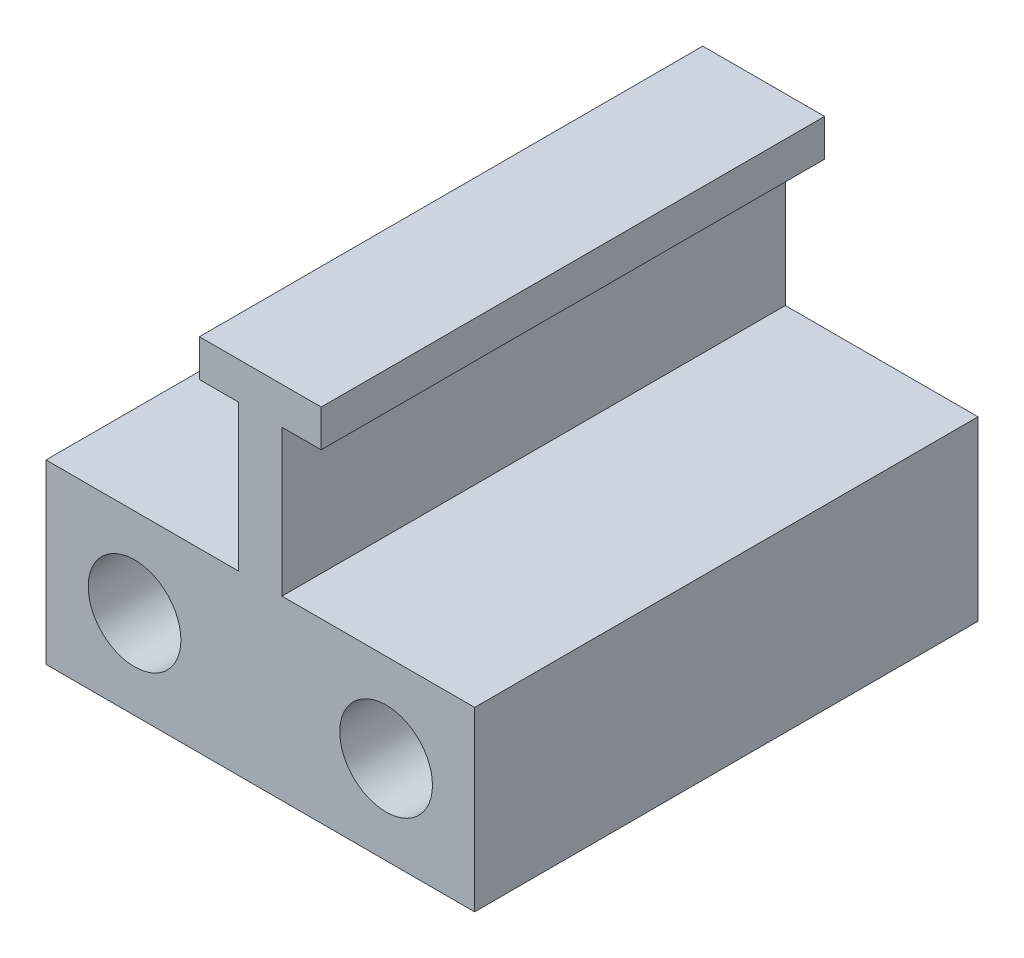
ISO-10303-21;
HEADER;
FILE_DESCRIPTION(('STEP AP214'),'2;1');
FILE_NAME('part.step','',(''),(''),'','','');
FILE_SCHEMA(('AUTOMOTIVE_DESIGN { 1 0 10303 214 1 1 1 1 }'));
ENDSEC;
DATA;
#1=APPLICATION_CONTEXT('core data for automotive mechanical design processes');
#2=APPLICATION_PROTOCOL_DEFINITION('international standard','automotive_design',2000,#1);
#3=PRODUCT_CONTEXT('',#1,'mechanical');
#4=PRODUCT('Part','Part','',(#3));
#5=PRODUCT_RELATED_PRODUCT_CATEGORY('part','',(#4));
#6=PRODUCT_DEFINITION_FORMATION('','',#4);
#7=PRODUCT_DEFINITION_CONTEXT('part definition',#1,'design');
#8=PRODUCT_DEFINITION('design','',#6,#7);
#9=PRODUCT_DEFINITION_SHAPE('','',#8);
#10=(LENGTH_UNIT() NAMED_UNIT(*) SI_UNIT(.MILLI.,.METRE.));
#11=(NAMED_UNIT(*) PLANE_ANGLE_UNIT() SI_UNIT($,.RADIAN.));
#12=(NAMED_UNIT(*) SI_UNIT($,.STERADIAN.) SOLID_ANGLE_UNIT());
#13=UNCERTAINTY_MEASURE_WITH_UNIT(LENGTH_MEASURE(1.E-05),#10,'distance_accuracy_value','');
#14=(GEOMETRIC_REPRESENTATION_CONTEXT(3) GLOBAL_UNCERTAINTY_ASSIGNED_CONTEXT((#13)) GLOBAL_UNIT_ASSIGNED_CONTEXT((#10,
#11,#12)) REPRESENTATION_CONTEXT('',''));
#15=CARTESIAN_POINT('',(0.,0.,0.));
#16=DIRECTION('',(0.,0.,1.));
#17=DIRECTION('',(1.,0.,0.));
#18=AXIS2_PLACEMENT_3D('',#15,#16,#17);
#19=CARTESIAN_POINT('',(0.,0.,81.44));
#20=DIRECTION('',(0.,0.,1.));
#21=DIRECTION('',(1.,0.,0.));
#22=AXIS2_PLACEMENT_3D('',#19,#20,#21);
#23=PLANE('',#22);
#24=CARTESIAN_POINT('',(-20.35,-4.77666915447525,81.44));
#25=DIRECTION('',(0.,0.,1.));
#26=DIRECTION('',(1.,0.,0.));
#27=AXIS2_PLACEMENT_3D('',#24,#25,#26);
#28=CIRCLE('',#27,7.5);
#29=CARTESIAN_POINT('',(-12.85,-4.77666915447525,81.44));
#30=VERTEX_POINT('',#29);
#31=EDGE_CURVE('E157',#30,#30,#28,.T.);
#32=ORIENTED_EDGE('',*,*,#31,.F.);
#33=EDGE_LOOP('',(#32));
#34=FACE_BOUND('',#33,.T.);
#35=DIRECTION('',(0.,1.,0.));
#36=VECTOR('',#35,1.);
#37=CARTESIAN_POINT('',(34.6762132,9.54954044552475,81.44));
#38=LINE('',#37,#36);
#39=CARTESIAN_POINT('',(34.6762132,-19.1028823544752,81.44));
#40=VERTEX_POINT('',#39);
#41=CARTESIAN_POINT('',(34.6762132,9.54954044552475,81.44));
#42=VERTEX_POINT('',#41);
#43=EDGE_CURVE('E177',#40,#42,#38,.T.);
#44=ORIENTED_EDGE('',*,*,#43,.T.);
#45=DIRECTION('',(-1.,0.,0.));
#46=VECTOR('',#45,1.);
#47=CARTESIAN_POINT('',(34.6762132,9.54954044552475,81.44));
#48=LINE('',#47,#46);
#49=CARTESIAN_POINT('',(3.5,9.54954044552474,81.44));
#50=VERTEX_POINT('',#49);
#51=EDGE_CURVE('E105',#42,#50,#48,.T.);
#52=ORIENTED_EDGE('',*,*,#51,.T.);
#53=DIRECTION('',(0.,1.,0.));
#54=VECTOR('',#53,1.);
#55=CARTESIAN_POINT('',(3.5,33.2233308455248,81.44));
#56=LINE('',#55,#54);
#57=CARTESIAN_POINT('',(3.5,33.2233308455248,81.44));
#58=VERTEX_POINT('',#57);
#59=EDGE_CURVE('E204',#50,#58,#56,.T.);
#60=ORIENTED_EDGE('',*,*,#59,.T.);
#61=DIRECTION('',(1.,0.,0.));
#62=VECTOR('',#61,1.);
#63=CARTESIAN_POINT('',(9.85,33.2233308455248,81.44));
#64=LINE('',#63,#62);
#65=CARTESIAN_POINT('',(9.85,33.2233308455248,81.44));
#66=VERTEX_POINT('',#65);
#67=EDGE_CURVE('E223',#58,#66,#64,.T.);
#68=ORIENTED_EDGE('',*,*,#67,.T.);
#69=DIRECTION('',(0.,1.,0.));
#70=VECTOR('',#69,1.);
#71=CARTESIAN_POINT('',(9.85,39.2233308455248,81.44));
#72=LINE('',#71,#70);
#73=CARTESIAN_POINT('',(9.85,39.2233308455248,81.44));
#74=VERTEX_POINT('',#73);
#75=EDGE_CURVE('E220',#66,#74,#72,.T.);
#76=ORIENTED_EDGE('',*,*,#75,.T.);
#77=DIRECTION('',(-1.,0.,0.));
#78=VECTOR('',#77,1.);
#79=CARTESIAN_POINT('',(-9.85,39.2233308455248,81.44));
#80=LINE('',#79,#78);
#81=CARTESIAN_POINT('',(-9.85,39.2233308455248,81.44));
#82=VERTEX_POINT('',#81);
#83=EDGE_CURVE('E222',#74,#82,#80,.T.);
#84=ORIENTED_EDGE('',*,*,#83,.T.);
#85=DIRECTION('',(0.,-1.,0.));
#86=VECTOR('',#85,1.);
#87=CARTESIAN_POINT('',(-9.85,39.2233308455248,81.44));
#88=LINE('',#87,#86);
#89=CARTESIAN_POINT('',(-9.85,33.2233308455248,81.44));
#90=VERTEX_POINT('',#89);
#91=EDGE_CURVE('E225',#82,#90,#88,.T.);
#92=ORIENTED_EDGE('',*,*,#91,.T.);
#93=DIRECTION('',(1.,0.,0.));
#94=VECTOR('',#93,1.);
#95=CARTESIAN_POINT('',(-9.85,33.2233308455248,81.44));
#96=LINE('',#95,#94);
#97=CARTESIAN_POINT('',(-3.5,33.2233308455248,81.44));
#98=VERTEX_POINT('',#97);
#99=EDGE_CURVE('E231',#90,#98,#96,.T.);
#100=ORIENTED_EDGE('',*,*,#99,.T.);
#101=DIRECTION('',(0.,-1.,0.));
#102=VECTOR('',#101,1.);
#103=CARTESIAN_POINT('',(-3.5,33.2233308455248,81.44));
#104=LINE('',#103,#102);
#105=CARTESIAN_POINT('',(-3.5,9.54954044552475,81.44));
#106=VERTEX_POINT('',#105);
#107=EDGE_CURVE('E136',#98,#106,#104,.T.);
#108=ORIENTED_EDGE('',*,*,#107,.T.);
#109=DIRECTION('',(-1.,0.,0.));
#110=VECTOR('',#109,1.);
#111=CARTESIAN_POINT('',(-10.165,9.54954044552475,81.44));
#112=LINE('',#111,#110);
#113=CARTESIAN_POINT('',(-34.6762132,9.54954044552475,81.44));
#114=VERTEX_POINT('',#113);
#115=EDGE_CURVE('E130',#106,#114,#112,.T.);
#116=ORIENTED_EDGE('',*,*,#115,.T.);
#117=DIRECTION('',(0.,-1.,0.));
#118=VECTOR('',#117,1.);
#119=CARTESIAN_POINT('',(-34.6762132,9.54954044552475,81.44));
#120=LINE('',#119,#118);
#121=CARTESIAN_POINT('',(-34.6762132,-19.1028823544752,81.44));
#122=VERTEX_POINT('',#121);
#123=EDGE_CURVE('E134',#114,#122,#120,.T.);
#124=ORIENTED_EDGE('',*,*,#123,.T.);
#125=DIRECTION('',(1.,0.,0.));
#126=VECTOR('',#125,1.);
#127=CARTESIAN_POINT('',(-34.6762132,-19.1028823544752,81.44));
#128=LINE('',#127,#126);
#129=EDGE_CURVE('E50',#122,#40,#128,.T.);
#130=ORIENTED_EDGE('',*,*,#129,.T.);
#131=EDGE_LOOP('',(#44,#52,#60,#68,#76,#84,#92,#100,#108,#116,#124,#130));
#132=FACE_BOUND('',#131,.T.);
#133=CARTESIAN_POINT('',(20.35,-4.77666915447525,81.44));
#134=DIRECTION('',(0.,0.,1.));
#135=DIRECTION('',(1.,0.,0.));
#136=AXIS2_PLACEMENT_3D('',#133,#134,#135);
#137=CIRCLE('',#136,7.49999999683155);
#138=CARTESIAN_POINT('',(27.8499999968315,-4.77666915447525,81.44));
#139=VERTEX_POINT('',#138);
#140=EDGE_CURVE('E274',#139,#139,#137,.T.);
#141=ORIENTED_EDGE('',*,*,#140,.F.);
#142=EDGE_LOOP('',(#141));
#143=FACE_BOUND('',#142,.T.);
#144=ADVANCED_FACE('F33',(#34,#132,#143),#23,.T.);
#145=CARTESIAN_POINT('',(0.,0.,0.));
#146=DIRECTION('',(0.,0.,1.));
#147=DIRECTION('',(1.,0.,0.));
#148=AXIS2_PLACEMENT_3D('',#145,#146,#147);
#149=PLANE('',#148);
#150=DIRECTION('',(0.,1.,0.));
#151=VECTOR('',#150,1.);
#152=CARTESIAN_POINT('',(34.6762132,9.54954044552475,0.));
#153=LINE('',#152,#151);
#154=CARTESIAN_POINT('',(34.6762132,-19.1028823544752,0.));
#155=VERTEX_POINT('',#154);
#156=CARTESIAN_POINT('',(34.6762132,9.54954044552475,0.));
#157=VERTEX_POINT('',#156);
#158=EDGE_CURVE('E153',#155,#157,#153,.T.);
#159=ORIENTED_EDGE('',*,*,#158,.F.);
#160=DIRECTION('',(1.,0.,0.));
#161=VECTOR('',#160,1.);
#162=CARTESIAN_POINT('',(-34.6762132,-19.1028823544752,0.));
#163=LINE('',#162,#161);
#164=CARTESIAN_POINT('',(-34.6762132,-19.1028823544752,0.));
#165=VERTEX_POINT('',#164);
#166=EDGE_CURVE('E97',#165,#155,#163,.T.);
#167=ORIENTED_EDGE('',*,*,#166,.F.);
#168=DIRECTION('',(0.,-1.,0.));
#169=VECTOR('',#168,1.);
#170=CARTESIAN_POINT('',(-34.6762132,9.54954044552475,0.));
#171=LINE('',#170,#169);
#172=CARTESIAN_POINT('',(-34.6762132,9.54954044552475,0.));
#173=VERTEX_POINT('',#172);
#174=EDGE_CURVE('E91',#173,#165,#171,.T.);
#175=ORIENTED_EDGE('',*,*,#174,.F.);
#176=DIRECTION('',(-1.,0.,0.));
#177=VECTOR('',#176,1.);
#178=CARTESIAN_POINT('',(-34.6762132,9.54954044552475,0.));
#179=LINE('',#178,#177);
#180=CARTESIAN_POINT('',(-3.5,9.54954044552475,0.));
#181=VERTEX_POINT('',#180);
#182=EDGE_CURVE('E143',#181,#173,#179,.T.);
#183=ORIENTED_EDGE('',*,*,#182,.F.);
#184=DIRECTION('',(0.,-1.,0.));
#185=VECTOR('',#184,1.);
#186=CARTESIAN_POINT('',(-3.5,33.2233308455248,0.));
#187=LINE('',#186,#185);
#188=CARTESIAN_POINT('',(-3.5,33.2233308455248,0.));
#189=VERTEX_POINT('',#188);
#190=EDGE_CURVE('E171',#189,#181,#187,.T.);
#191=ORIENTED_EDGE('',*,*,#190,.F.);
#192=DIRECTION('',(1.,0.,0.));
#193=VECTOR('',#192,1.);
#194=CARTESIAN_POINT('',(-9.85,33.2233308455248,0.));
#195=LINE('',#194,#193);
#196=CARTESIAN_POINT('',(-9.85,33.2233308455248,0.));
#197=VERTEX_POINT('',#196);
#198=EDGE_CURVE('E169',#197,#189,#195,.T.);
#199=ORIENTED_EDGE('',*,*,#198,.F.);
#200=DIRECTION('',(0.,-1.,0.));
#201=VECTOR('',#200,1.);
#202=CARTESIAN_POINT('',(-9.85,39.2233308455248,0.));
#203=LINE('',#202,#201);
#204=CARTESIAN_POINT('',(-9.85,39.2233308455248,0.));
#205=VERTEX_POINT('',#204);
#206=EDGE_CURVE('E167',#205,#197,#203,.T.);
#207=ORIENTED_EDGE('',*,*,#206,.F.);
#208=DIRECTION('',(-1.,0.,0.));
#209=VECTOR('',#208,1.);
#210=CARTESIAN_POINT('',(-9.85,39.2233308455248,0.));
#211=LINE('',#210,#209);
#212=CARTESIAN_POINT('',(9.85,39.2233308455248,0.));
#213=VERTEX_POINT('',#212);
#214=EDGE_CURVE('E165',#213,#205,#211,.T.);
#215=ORIENTED_EDGE('',*,*,#214,.F.);
#216=DIRECTION('',(0.,1.,0.));
#217=VECTOR('',#216,1.);
#218=CARTESIAN_POINT('',(9.85,39.2233308455248,0.));
#219=LINE('',#218,#217);
#220=CARTESIAN_POINT('',(9.85,33.2233308455248,0.));
#221=VERTEX_POINT('',#220);
#222=EDGE_CURVE('E163',#221,#213,#219,.T.);
#223=ORIENTED_EDGE('',*,*,#222,.F.);
#224=DIRECTION('',(1.,0.,0.));
#225=VECTOR('',#224,1.);
#226=CARTESIAN_POINT('',(9.85,33.2233308455248,0.));
#227=LINE('',#226,#225);
#228=CARTESIAN_POINT('',(3.5,33.2233308455248,0.));
#229=VERTEX_POINT('',#228);
#230=EDGE_CURVE('E161',#229,#221,#227,.T.);
#231=ORIENTED_EDGE('',*,*,#230,.F.);
#232=DIRECTION('',(0.,1.,0.));
#233=VECTOR('',#232,1.);
#234=CARTESIAN_POINT('',(3.5,33.2233308455248,0.));
#235=LINE('',#234,#233);
#236=CARTESIAN_POINT('',(3.5,9.54954044552474,0.));
#237=VERTEX_POINT('',#236);
#238=EDGE_CURVE('E159',#237,#229,#235,.T.);
#239=ORIENTED_EDGE('',*,*,#238,.F.);
#240=DIRECTION('',(-1.,0.,0.));
#241=VECTOR('',#240,1.);
#242=CARTESIAN_POINT('',(10.165,9.54954044552474,0.));
#243=LINE('',#242,#241);
#244=EDGE_CURVE('E156',#157,#237,#243,.T.);
#245=ORIENTED_EDGE('',*,*,#244,.F.);
#246=EDGE_LOOP('',(#159,#167,#175,#183,#191,#199,#207,#215,#223,#231,#239,#245));
#247=FACE_BOUND('',#246,.T.);
#248=CARTESIAN_POINT('',(-20.35,-4.77666915447525,0.));
#249=DIRECTION('',(0.,0.,1.));
#250=DIRECTION('',(1.,0.,0.));
#251=AXIS2_PLACEMENT_3D('',#248,#249,#250);
#252=CIRCLE('',#251,7.5);
#253=CARTESIAN_POINT('',(-12.85,-4.77666915447525,0.));
#254=VERTEX_POINT('',#253);
#255=EDGE_CURVE('E280',#254,#254,#252,.T.);
#256=ORIENTED_EDGE('',*,*,#255,.T.);
#257=EDGE_LOOP('',(#256));
#258=FACE_BOUND('',#257,.T.);
#259=CARTESIAN_POINT('',(20.35,-4.77666915447525,0.));
#260=DIRECTION('',(0.,0.,1.));
#261=DIRECTION('',(1.,0.,0.));
#262=AXIS2_PLACEMENT_3D('',#259,#260,#261);
#263=CIRCLE('',#262,7.49999999683155);
#264=CARTESIAN_POINT('',(27.8499999968315,-4.77666915447525,0.));
#265=VERTEX_POINT('',#264);
#266=EDGE_CURVE('E277',#265,#265,#263,.T.);
#267=ORIENTED_EDGE('',*,*,#266,.T.);
#268=EDGE_LOOP('',(#267));
#269=FACE_BOUND('',#268,.T.);
#270=ADVANCED_FACE('F208',(#247,#258,#269),#149,.F.);
#271=CARTESIAN_POINT('',(34.6762132,9.54954044552475,81.44));
#272=DIRECTION('',(-1.,0.,0.));
#273=DIRECTION('',(0.,-1.,0.));
#274=AXIS2_PLACEMENT_3D('',#271,#272,#273);
#275=PLANE('',#274);
#276=ORIENTED_EDGE('',*,*,#158,.T.);
#277=DIRECTION('',(0.,0.,-1.));
#278=VECTOR('',#277,1.);
#279=CARTESIAN_POINT('',(34.6762132,9.54954044552475,81.44));
#280=LINE('',#279,#278);
#281=EDGE_CURVE('E11',#42,#157,#280,.T.);
#282=ORIENTED_EDGE('',*,*,#281,.F.);
#283=ORIENTED_EDGE('',*,*,#43,.F.);
#284=DIRECTION('',(0.,0.,-1.));
#285=VECTOR('',#284,1.);
#286=CARTESIAN_POINT('',(34.6762132,-19.1028823544752,81.44));
#287=LINE('',#286,#285);
#288=EDGE_CURVE('E149',#40,#155,#287,.T.);
#289=ORIENTED_EDGE('',*,*,#288,.T.);
#290=EDGE_LOOP('',(#276,#282,#283,#289));
#291=FACE_BOUND('',#290,.T.);
#292=ADVANCED_FACE('F35',(#291),#275,.F.);
#293=CARTESIAN_POINT('',(10.165,9.54954044552474,81.44));
#294=DIRECTION('',(0.,-1.,0.));
#295=DIRECTION('',(1.,0.,0.));
#296=AXIS2_PLACEMENT_3D('',#293,#294,#295);
#297=PLANE('',#296);
#298=ORIENTED_EDGE('',*,*,#244,.T.);
#299=DIRECTION('',(0.,0.,-1.));
#300=VECTOR('',#299,1.);
#301=CARTESIAN_POINT('',(3.5,9.54954044552474,81.44));
#302=LINE('',#301,#300);
#303=EDGE_CURVE('E42',#50,#237,#302,.T.);
#304=ORIENTED_EDGE('',*,*,#303,.F.);
#305=ORIENTED_EDGE('',*,*,#51,.F.);
#306=ORIENTED_EDGE('',*,*,#281,.T.);
#307=EDGE_LOOP('',(#298,#304,#305,#306));
#308=FACE_BOUND('',#307,.T.);
#309=ADVANCED_FACE('F374',(#308),#297,.F.);
#310=CARTESIAN_POINT('',(3.5,33.2233308455248,81.44));
#311=DIRECTION('',(-1.,0.,0.));
#312=DIRECTION('',(0.,-1.,0.));
#313=AXIS2_PLACEMENT_3D('',#310,#311,#312);
#314=PLANE('',#313);
#315=ORIENTED_EDGE('',*,*,#238,.T.);
#316=DIRECTION('',(0.,0.,-1.));
#317=VECTOR('',#316,1.);
#318=CARTESIAN_POINT('',(3.5,33.2233308455248,81.44));
#319=LINE('',#318,#317);
#320=EDGE_CURVE('E196',#58,#229,#319,.T.);
#321=ORIENTED_EDGE('',*,*,#320,.F.);
#322=ORIENTED_EDGE('',*,*,#59,.F.);
#323=ORIENTED_EDGE('',*,*,#303,.T.);
#324=EDGE_LOOP('',(#315,#321,#322,#323));
#325=FACE_BOUND('',#324,.T.);
#326=ADVANCED_FACE('F202',(#325),#314,.F.);
#327=CARTESIAN_POINT('',(9.85,33.2233308455248,81.44));
#328=DIRECTION('',(0.,1.,0.));
#329=DIRECTION('',(0.,0.,1.));
#330=AXIS2_PLACEMENT_3D('',#327,#328,#329);
#331=PLANE('',#330);
#332=ORIENTED_EDGE('',*,*,#230,.T.);
#333=DIRECTION('',(0.,0.,-1.));
#334=VECTOR('',#333,1.);
#335=CARTESIAN_POINT('',(9.85,33.2233308455248,81.44));
#336=LINE('',#335,#334);
#337=EDGE_CURVE('E193',#66,#221,#336,.T.);
#338=ORIENTED_EDGE('',*,*,#337,.F.);
#339=ORIENTED_EDGE('',*,*,#67,.F.);
#340=ORIENTED_EDGE('',*,*,#320,.T.);
#341=EDGE_LOOP('',(#332,#338,#339,#340));
#342=FACE_BOUND('',#341,.T.);
#343=ADVANCED_FACE('F214',(#342),#331,.F.);
#344=CARTESIAN_POINT('',(9.85,39.2233308455248,81.44));
#345=DIRECTION('',(-1.,0.,0.));
#346=DIRECTION('',(0.,-1.,0.));
#347=AXIS2_PLACEMENT_3D('',#344,#345,#346);
#348=PLANE('',#347);
#349=ORIENTED_EDGE('',*,*,#222,.T.);
#350=DIRECTION('',(0.,0.,-1.));
#351=VECTOR('',#350,1.);
#352=CARTESIAN_POINT('',(9.85,39.2233308455248,81.44));
#353=LINE('',#352,#351);
#354=EDGE_CURVE('E190',#74,#213,#353,.T.);
#355=ORIENTED_EDGE('',*,*,#354,.F.);
#356=ORIENTED_EDGE('',*,*,#75,.F.);
#357=ORIENTED_EDGE('',*,*,#337,.T.);
#358=EDGE_LOOP('',(#349,#355,#356,#357));
#359=FACE_BOUND('',#358,.T.);
#360=ADVANCED_FACE('F218',(#359),#348,.F.);
#361=CARTESIAN_POINT('',(-9.85,39.2233308455248,81.44));
#362=DIRECTION('',(0.,-1.,0.));
#363=DIRECTION('',(0.,0.,-1.));
#364=AXIS2_PLACEMENT_3D('',#361,#362,#363);
#365=PLANE('',#364);
#366=ORIENTED_EDGE('',*,*,#214,.T.);
#367=DIRECTION('',(0.,0.,-1.));
#368=VECTOR('',#367,1.);
#369=CARTESIAN_POINT('',(-9.85,39.2233308455248,81.44));
#370=LINE('',#369,#368);
#371=EDGE_CURVE('E187',#82,#205,#370,.T.);
#372=ORIENTED_EDGE('',*,*,#371,.F.);
#373=ORIENTED_EDGE('',*,*,#83,.F.);
#374=ORIENTED_EDGE('',*,*,#354,.T.);
#375=EDGE_LOOP('',(#366,#372,#373,#374));
#376=FACE_BOUND('',#375,.T.);
#377=ADVANCED_FACE('F339',(#376),#365,.F.);
#378=CARTESIAN_POINT('',(-9.85,39.2233308455248,81.44));
#379=DIRECTION('',(1.,0.,0.));
#380=DIRECTION('',(0.,0.,-1.));
#381=AXIS2_PLACEMENT_3D('',#378,#379,#380);
#382=PLANE('',#381);
#383=ORIENTED_EDGE('',*,*,#206,.T.);
#384=DIRECTION('',(0.,0.,-1.));
#385=VECTOR('',#384,1.);
#386=CARTESIAN_POINT('',(-9.85,33.2233308455248,81.44));
#387=LINE('',#386,#385);
#388=EDGE_CURVE('E184',#90,#197,#387,.T.);
#389=ORIENTED_EDGE('',*,*,#388,.F.);
#390=ORIENTED_EDGE('',*,*,#91,.F.);
#391=ORIENTED_EDGE('',*,*,#371,.T.);
#392=EDGE_LOOP('',(#383,#389,#390,#391));
#393=FACE_BOUND('',#392,.T.);
#394=ADVANCED_FACE('F330',(#393),#382,.F.);
#395=CARTESIAN_POINT('',(-9.85,33.2233308455248,81.44));
#396=DIRECTION('',(0.,1.,0.));
#397=DIRECTION('',(0.,0.,1.));
#398=AXIS2_PLACEMENT_3D('',#395,#396,#397);
#399=PLANE('',#398);
#400=ORIENTED_EDGE('',*,*,#198,.T.);
#401=DIRECTION('',(0.,0.,-1.));
#402=VECTOR('',#401,1.);
#403=CARTESIAN_POINT('',(-3.5,33.2233308455248,81.44));
#404=LINE('',#403,#402);
#405=EDGE_CURVE('E181',#98,#189,#404,.T.);
#406=ORIENTED_EDGE('',*,*,#405,.F.);
#407=ORIENTED_EDGE('',*,*,#99,.F.);
#408=ORIENTED_EDGE('',*,*,#388,.T.);
#409=EDGE_LOOP('',(#400,#406,#407,#408));
#410=FACE_BOUND('',#409,.T.);
#411=ADVANCED_FACE('F237',(#410),#399,.F.);
#412=CARTESIAN_POINT('',(-3.5,33.2233308455248,81.44));
#413=DIRECTION('',(1.,0.,0.));
#414=DIRECTION('',(0.,1.,0.));
#415=AXIS2_PLACEMENT_3D('',#412,#413,#414);
#416=PLANE('',#415);
#417=ORIENTED_EDGE('',*,*,#190,.T.);
#418=DIRECTION('',(0.,0.,-1.));
#419=VECTOR('',#418,1.);
#420=CARTESIAN_POINT('',(-3.5,9.54954044552475,81.44));
#421=LINE('',#420,#419);
#422=EDGE_CURVE('E144',#106,#181,#421,.T.);
#423=ORIENTED_EDGE('',*,*,#422,.F.);
#424=ORIENTED_EDGE('',*,*,#107,.F.);
#425=ORIENTED_EDGE('',*,*,#405,.T.);
#426=EDGE_LOOP('',(#417,#423,#424,#425));
#427=FACE_BOUND('',#426,.T.);
#428=ADVANCED_FACE('F241',(#427),#416,.F.);
#429=CARTESIAN_POINT('',(-34.6762132,9.54954044552475,81.44));
#430=DIRECTION('',(0.,-1.,0.));
#431=DIRECTION('',(0.,0.,-1.));
#432=AXIS2_PLACEMENT_3D('',#429,#430,#431);
#433=PLANE('',#432);
#434=ORIENTED_EDGE('',*,*,#182,.T.);
#435=DIRECTION('',(0.,0.,-1.));
#436=VECTOR('',#435,1.);
#437=CARTESIAN_POINT('',(-34.6762132,9.54954044552475,81.44));
#438=LINE('',#437,#436);
#439=EDGE_CURVE('E141',#114,#173,#438,.T.);
#440=ORIENTED_EDGE('',*,*,#439,.F.);
#441=ORIENTED_EDGE('',*,*,#115,.F.);
#442=ORIENTED_EDGE('',*,*,#422,.T.);
#443=EDGE_LOOP('',(#434,#440,#441,#442));
#444=FACE_BOUND('',#443,.T.);
#445=ADVANCED_FACE('F142',(#444),#433,.F.);
#446=CARTESIAN_POINT('',(-34.6762132,9.54954044552475,81.44));
#447=DIRECTION('',(1.,0.,0.));
#448=DIRECTION('',(0.,1.,0.));
#449=AXIS2_PLACEMENT_3D('',#446,#447,#448);
#450=PLANE('',#449);
#451=ORIENTED_EDGE('',*,*,#174,.T.);
#452=DIRECTION('',(0.,0.,-1.));
#453=VECTOR('',#452,1.);
#454=CARTESIAN_POINT('',(-34.6762132,-19.1028823544752,81.44));
#455=LINE('',#454,#453);
#456=EDGE_CURVE('E145',#122,#165,#455,.T.);
#457=ORIENTED_EDGE('',*,*,#456,.F.);
#458=ORIENTED_EDGE('',*,*,#123,.F.);
#459=ORIENTED_EDGE('',*,*,#439,.T.);
#460=EDGE_LOOP('',(#451,#457,#458,#459));
#461=FACE_BOUND('',#460,.T.);
#462=ADVANCED_FACE('F147',(#461),#450,.F.);
#463=CARTESIAN_POINT('',(-34.6762132,-19.1028823544752,81.44));
#464=DIRECTION('',(0.,1.,0.));
#465=DIRECTION('',(-1.,0.,0.));
#466=AXIS2_PLACEMENT_3D('',#463,#464,#465);
#467=PLANE('',#466);
#468=ORIENTED_EDGE('',*,*,#166,.T.);
#469=ORIENTED_EDGE('',*,*,#288,.F.);
#470=ORIENTED_EDGE('',*,*,#129,.F.);
#471=ORIENTED_EDGE('',*,*,#456,.T.);
#472=EDGE_LOOP('',(#468,#469,#470,#471));
#473=FACE_BOUND('',#472,.T.);
#474=ADVANCED_FACE('F246',(#473),#467,.F.);
#475=CARTESIAN_POINT('',(-20.35,-4.77666915447525,81.44));
#476=DIRECTION('',(0.,0.,-1.));
#477=DIRECTION('',(-1.,0.,0.));
#478=AXIS2_PLACEMENT_3D('',#475,#476,#477);
#479=CYLINDRICAL_SURFACE('',#478,7.5);
#480=ORIENTED_EDGE('',*,*,#31,.T.);
#481=EDGE_LOOP('',(#480));
#482=FACE_BOUND('',#481,.T.);
#483=ORIENTED_EDGE('',*,*,#255,.F.);
#484=EDGE_LOOP('',(#483));
#485=FACE_BOUND('',#484,.T.);
#486=ADVANCED_FACE('F248',(#482,#485),#479,.F.);
#487=CARTESIAN_POINT('',(20.35,-4.77666915447525,81.44));
#488=DIRECTION('',(0.,0.,-1.));
#489=DIRECTION('',(-1.,0.,0.));
#490=AXIS2_PLACEMENT_3D('',#487,#488,#489);
#491=CYLINDRICAL_SURFACE('',#490,7.49999999683155);
#492=ORIENTED_EDGE('',*,*,#140,.T.);
#493=EDGE_LOOP('',(#492));
#494=FACE_BOUND('',#493,.T.);
#495=ORIENTED_EDGE('',*,*,#266,.F.);
#496=EDGE_LOOP('',(#495));
#497=FACE_BOUND('',#496,.T.);
#498=ADVANCED_FACE('F254',(#494,#497),#491,.F.);
#499=CLOSED_SHELL('',(#144,#270,#292,#309,#326,#343,#360,#377,#394,#411,#428,#445,#462,#474,
#486,#498));
#500=MANIFOLD_SOLID_BREP('B2',#499);
#501=ADVANCED_BREP_SHAPE_REPRESENTATION('',(#18,#500),#14);
#502=SHAPE_DEFINITION_REPRESENTATION(#9,#501);
ENDSEC;
END-ISO-10303-21;
